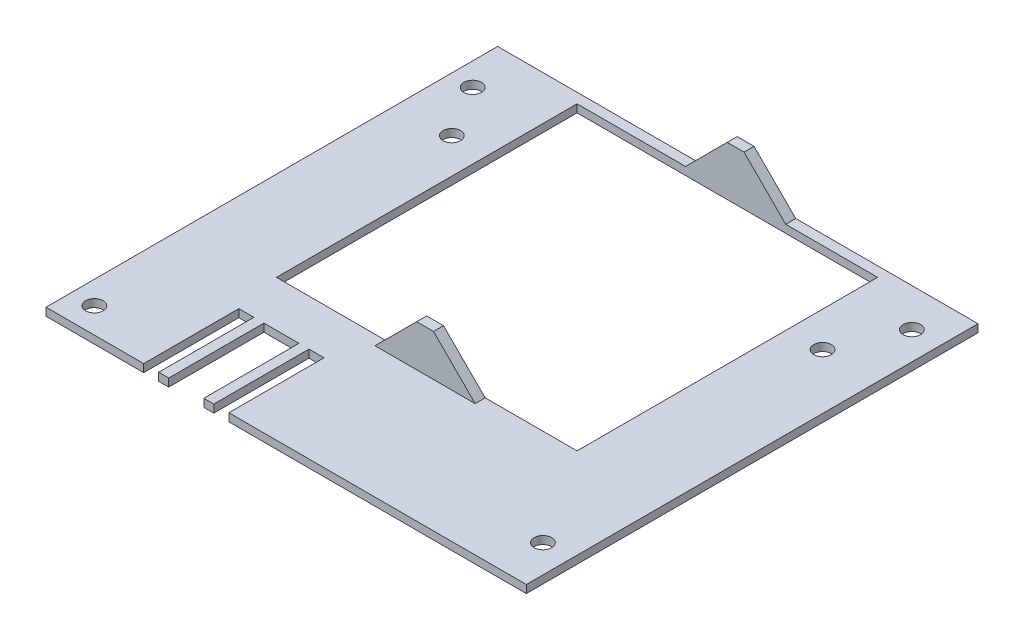
ISO-10303-21;
HEADER;
FILE_DESCRIPTION(('STEP AP214'),'2;1');
FILE_NAME('part.step','',(''),(''),'','','');
FILE_SCHEMA(('AUTOMOTIVE_DESIGN { 1 0 10303 214 1 1 1 1 }'));
ENDSEC;
DATA;
#1=APPLICATION_CONTEXT('core data for automotive mechanical design processes');
#2=APPLICATION_PROTOCOL_DEFINITION('international standard','automotive_design',2000,#1);
#3=PRODUCT_CONTEXT('',#1,'mechanical');
#4=PRODUCT('Part','Part','',(#3));
#5=PRODUCT_RELATED_PRODUCT_CATEGORY('part','',(#4));
#6=PRODUCT_DEFINITION_FORMATION('','',#4);
#7=PRODUCT_DEFINITION_CONTEXT('part definition',#1,'design');
#8=PRODUCT_DEFINITION('design','',#6,#7);
#9=PRODUCT_DEFINITION_SHAPE('','',#8);
#10=(LENGTH_UNIT() NAMED_UNIT(*) SI_UNIT(.MILLI.,.METRE.));
#11=(NAMED_UNIT(*) PLANE_ANGLE_UNIT() SI_UNIT($,.RADIAN.));
#12=(NAMED_UNIT(*) SI_UNIT($,.STERADIAN.) SOLID_ANGLE_UNIT());
#13=UNCERTAINTY_MEASURE_WITH_UNIT(LENGTH_MEASURE(1.E-05),#10,'distance_accuracy_value','');
#14=(GEOMETRIC_REPRESENTATION_CONTEXT(3) GLOBAL_UNCERTAINTY_ASSIGNED_CONTEXT((#13)) GLOBAL_UNIT_ASSIGNED_CONTEXT((#10,
#11,#12)) REPRESENTATION_CONTEXT('',''));
#15=CARTESIAN_POINT('',(0.,0.,0.));
#16=DIRECTION('',(0.,0.,1.));
#17=DIRECTION('',(1.,0.,0.));
#18=AXIS2_PLACEMENT_3D('',#15,#16,#17);
#19=CARTESIAN_POINT('',(-32.2440500490529,1.57,-18.5489965335949));
#20=DIRECTION('',(0.,0.,-1.));
#21=DIRECTION('',(-1.,0.,0.));
#22=AXIS2_PLACEMENT_3D('',#19,#20,#21);
#23=PLANE('',#22);
#24=DIRECTION('',(1.,0.,0.));
#25=VECTOR('',#24,1.);
#26=CARTESIAN_POINT('',(-32.2440500490529,0.,-18.5489965335949));
#27=LINE('',#26,#25);
#28=CARTESIAN_POINT('',(-0.244050049052909,0.,-18.5489965335949));
#29=VERTEX_POINT('',#28);
#30=CARTESIAN_POINT('',(1.75594995094709,0.,-18.5489965335949));
#31=VERTEX_POINT('',#30);
#32=EDGE_CURVE('E518',#29,#31,#27,.T.);
#33=ORIENTED_EDGE('',*,*,#32,.T.);
#34=DIRECTION('',(0.,1.,0.));
#35=VECTOR('',#34,1.);
#36=CARTESIAN_POINT('',(1.75594995094709,0.,-18.5489965335949));
#37=LINE('',#36,#35);
#38=CARTESIAN_POINT('',(1.75594995094709,1.57,-18.5489965335949));
#39=VERTEX_POINT('',#38);
#40=EDGE_CURVE('E280',#31,#39,#37,.T.);
#41=ORIENTED_EDGE('',*,*,#40,.T.);
#42=DIRECTION('',(1.,0.,0.));
#43=VECTOR('',#42,1.);
#44=CARTESIAN_POINT('',(-32.2440500490529,1.57,-18.5489965335949));
#45=LINE('',#44,#43);
#46=CARTESIAN_POINT('',(-0.244050049052909,1.57,-18.5489965335949));
#47=VERTEX_POINT('',#46);
#48=EDGE_CURVE('E534',#47,#39,#45,.T.);
#49=ORIENTED_EDGE('',*,*,#48,.F.);
#50=DIRECTION('',(0.,1.,0.));
#51=VECTOR('',#50,1.);
#52=CARTESIAN_POINT('',(-0.244050049052909,0.,-18.5489965335949));
#53=LINE('',#52,#51);
#54=EDGE_CURVE('E318',#29,#47,#53,.T.);
#55=ORIENTED_EDGE('',*,*,#54,.F.);
#56=EDGE_LOOP('',(#33,#41,#49,#55));
#57=FACE_BOUND('',#56,.T.);
#58=ADVANCED_FACE('F35',(#57),#23,.F.);
#59=CARTESIAN_POINT('',(-9.24405004905291,0.,-18.5489965335949));
#60=VERTEX_POINT('',#59);
#61=CARTESIAN_POINT('',(-7.24405004905291,0.,-18.5489965335949));
#62=VERTEX_POINT('',#61);
#63=EDGE_CURVE('E443',#60,#62,#27,.T.);
#64=ORIENTED_EDGE('',*,*,#63,.T.);
#65=DIRECTION('',(0.,1.,0.));
#66=VECTOR('',#65,1.);
#67=CARTESIAN_POINT('',(-7.24405004905291,0.,-18.5489965335949));
#68=LINE('',#67,#66);
#69=CARTESIAN_POINT('',(-7.24405004905291,1.57,-18.5489965335949));
#70=VERTEX_POINT('',#69);
#71=EDGE_CURVE('E306',#62,#70,#68,.T.);
#72=ORIENTED_EDGE('',*,*,#71,.T.);
#73=CARTESIAN_POINT('',(-9.24405004905291,1.57,-18.5489965335949));
#74=VERTEX_POINT('',#73);
#75=EDGE_CURVE('E435',#74,#70,#45,.T.);
#76=ORIENTED_EDGE('',*,*,#75,.F.);
#77=DIRECTION('',(0.,1.,0.));
#78=VECTOR('',#77,1.);
#79=CARTESIAN_POINT('',(-9.24405004905291,0.,-18.5489965335949));
#80=LINE('',#79,#78);
#81=EDGE_CURVE('E340',#60,#74,#80,.T.);
#82=ORIENTED_EDGE('',*,*,#81,.F.);
#83=EDGE_LOOP('',(#64,#72,#76,#82));
#84=FACE_BOUND('',#83,.T.);
#85=ADVANCED_FACE('F516',(#84),#23,.F.);
#86=CARTESIAN_POINT('',(4.75594995094709,0.,-18.5489965335949));
#87=VERTEX_POINT('',#86);
#88=CARTESIAN_POINT('',(64.1459499509471,0.,-18.5489965335949));
#89=VERTEX_POINT('',#88);
#90=EDGE_CURVE('E429',#87,#89,#27,.T.);
#91=ORIENTED_EDGE('',*,*,#90,.T.);
#92=DIRECTION('',(0.,1.,0.));
#93=VECTOR('',#92,1.);
#94=CARTESIAN_POINT('',(64.1459499509471,-8.43,-18.5489965335949));
#95=LINE('',#94,#93);
#96=CARTESIAN_POINT('',(64.1459499509471,1.57,-18.5489965335949));
#97=VERTEX_POINT('',#96);
#98=EDGE_CURVE('E58',#89,#97,#95,.T.);
#99=ORIENTED_EDGE('',*,*,#98,.T.);
#100=CARTESIAN_POINT('',(4.75594995094709,1.57,-18.5489965335949));
#101=VERTEX_POINT('',#100);
#102=EDGE_CURVE('E436',#101,#97,#45,.T.);
#103=ORIENTED_EDGE('',*,*,#102,.F.);
#104=DIRECTION('',(0.,1.,0.));
#105=VECTOR('',#104,1.);
#106=CARTESIAN_POINT('',(4.75594995094709,0.,-18.5489965335949));
#107=LINE('',#106,#105);
#108=EDGE_CURVE('E292',#87,#101,#107,.T.);
#109=ORIENTED_EDGE('',*,*,#108,.F.);
#110=EDGE_LOOP('',(#91,#99,#103,#109));
#111=FACE_BOUND('',#110,.T.);
#112=ADVANCED_FACE('F527',(#111),#23,.F.);
#113=CARTESIAN_POINT('',(0.,1.57,0.));
#114=DIRECTION('',(0.,1.,0.));
#115=DIRECTION('',(0.,0.,1.));
#116=AXIS2_PLACEMENT_3D('',#113,#114,#115);
#117=PLANE('',#116);
#118=DIRECTION('',(-1.,0.,0.));
#119=VECTOR('',#118,1.);
#120=CARTESIAN_POINT('',(-13.8940500490529,1.57,-106.718996533595));
#121=LINE('',#120,#119);
#122=CARTESIAN_POINT('',(7.75594995094709,1.57,-106.718996533595));
#123=VERTEX_POINT('',#122);
#124=CARTESIAN_POINT('',(-13.8940500490529,1.57,-106.718996533595));
#125=VERTEX_POINT('',#124);
#126=EDGE_CURVE('E249',#123,#125,#121,.T.);
#127=ORIENTED_EDGE('',*,*,#126,.F.);
#128=DIRECTION('',(0.,0.,-1.));
#129=VECTOR('',#128,1.);
#130=CARTESIAN_POINT('',(7.75594995094709,1.57,-106.718996533595));
#131=LINE('',#130,#129);
#132=CARTESIAN_POINT('',(7.75594995094709,1.57,-108.718996533595));
#133=VERTEX_POINT('',#132);
#134=EDGE_CURVE('E357',#123,#133,#131,.T.);
#135=ORIENTED_EDGE('',*,*,#134,.T.);
#136=DIRECTION('',(-1.,0.,0.));
#137=VECTOR('',#136,1.);
#138=CARTESIAN_POINT('',(-32.2440500490529,1.57,-108.718996533595));
#139=LINE('',#138,#137);
#140=CARTESIAN_POINT('',(-31.7440500490529,1.57,-108.718996533595));
#141=VERTEX_POINT('',#140);
#142=EDGE_CURVE('E434',#133,#141,#139,.T.);
#143=ORIENTED_EDGE('',*,*,#142,.T.);
#144=DIRECTION('',(0.,0.,-1.));
#145=VECTOR('',#144,1.);
#146=CARTESIAN_POINT('',(-31.7440500490529,1.57,-18.5489965335949));
#147=LINE('',#146,#145);
#148=CARTESIAN_POINT('',(-31.7440500490529,1.57,-18.5489965335949));
#149=VERTEX_POINT('',#148);
#150=EDGE_CURVE('E261',#149,#141,#147,.T.);
#151=ORIENTED_EDGE('',*,*,#150,.F.);
#152=CARTESIAN_POINT('',(-12.2440500490529,1.57,-18.5489965335949));
#153=VERTEX_POINT('',#152);
#154=EDGE_CURVE('E432',#149,#153,#45,.T.);
#155=ORIENTED_EDGE('',*,*,#154,.T.);
#156=DIRECTION('',(0.,0.,1.));
#157=VECTOR('',#156,1.);
#158=CARTESIAN_POINT('',(-12.2440500490529,1.57,-18.5489965335949));
#159=LINE('',#158,#157);
#160=CARTESIAN_POINT('',(-12.2440500490529,1.57,-37.5489965335949));
#161=VERTEX_POINT('',#160);
#162=EDGE_CURVE('E326',#161,#153,#159,.T.);
#163=ORIENTED_EDGE('',*,*,#162,.F.);
#164=DIRECTION('',(-1.,0.,0.));
#165=VECTOR('',#164,1.);
#166=CARTESIAN_POINT('',(-9.24405004905291,1.57,-37.5489965335949));
#167=LINE('',#166,#165);
#168=CARTESIAN_POINT('',(-9.24405004905291,1.57,-37.5489965335949));
#169=VERTEX_POINT('',#168);
#170=EDGE_CURVE('E335',#169,#161,#167,.T.);
#171=ORIENTED_EDGE('',*,*,#170,.F.);
#172=DIRECTION('',(0.,0.,-1.));
#173=VECTOR('',#172,1.);
#174=CARTESIAN_POINT('',(-9.24405004905291,1.57,-18.5489965335949));
#175=LINE('',#174,#173);
#176=EDGE_CURVE('E315',#74,#169,#175,.T.);
#177=ORIENTED_EDGE('',*,*,#176,.F.);
#178=ORIENTED_EDGE('',*,*,#75,.T.);
#179=DIRECTION('',(0.,0.,1.));
#180=VECTOR('',#179,1.);
#181=CARTESIAN_POINT('',(-7.24405004905291,1.57,-18.5489965335949));
#182=LINE('',#181,#180);
#183=CARTESIAN_POINT('',(-7.24405004905291,1.57,-37.5489965335949));
#184=VERTEX_POINT('',#183);
#185=EDGE_CURVE('E289',#184,#70,#182,.T.);
#186=ORIENTED_EDGE('',*,*,#185,.F.);
#187=DIRECTION('',(-1.,0.,0.));
#188=VECTOR('',#187,1.);
#189=CARTESIAN_POINT('',(-7.24405004905291,1.57,-37.5489965335949));
#190=LINE('',#189,#188);
#191=CARTESIAN_POINT('',(-0.244050049052909,1.57,-37.5489965335949));
#192=VERTEX_POINT('',#191);
#193=EDGE_CURVE('E300',#192,#184,#190,.T.);
#194=ORIENTED_EDGE('',*,*,#193,.F.);
#195=DIRECTION('',(0.,0.,-1.));
#196=VECTOR('',#195,1.);
#197=CARTESIAN_POINT('',(-0.244050049052909,1.57,-18.5489965335949));
#198=LINE('',#197,#196);
#199=EDGE_CURVE('E308',#47,#192,#198,.T.);
#200=ORIENTED_EDGE('',*,*,#199,.F.);
#201=ORIENTED_EDGE('',*,*,#48,.T.);
#202=DIRECTION('',(0.,0.,1.));
#203=VECTOR('',#202,1.);
#204=CARTESIAN_POINT('',(1.75594995094709,1.57,-18.5489965335949));
#205=LINE('',#204,#203);
#206=CARTESIAN_POINT('',(1.75594995094709,1.57,-37.5489965335949));
#207=VERTEX_POINT('',#206);
#208=EDGE_CURVE('E268',#207,#39,#205,.T.);
#209=ORIENTED_EDGE('',*,*,#208,.F.);
#210=DIRECTION('',(-1.,0.,0.));
#211=VECTOR('',#210,1.);
#212=CARTESIAN_POINT('',(1.75594995094709,1.57,-37.5489965335949));
#213=LINE('',#212,#211);
#214=CARTESIAN_POINT('',(4.75594995094709,1.57,-37.5489965335949));
#215=VERTEX_POINT('',#214);
#216=EDGE_CURVE('E274',#215,#207,#213,.T.);
#217=ORIENTED_EDGE('',*,*,#216,.F.);
#218=DIRECTION('',(0.,0.,-1.));
#219=VECTOR('',#218,1.);
#220=CARTESIAN_POINT('',(4.75594995094709,1.57,-18.5489965335949));
#221=LINE('',#220,#219);
#222=EDGE_CURVE('E282',#101,#215,#221,.T.);
#223=ORIENTED_EDGE('',*,*,#222,.F.);
#224=ORIENTED_EDGE('',*,*,#102,.T.);
#225=DIRECTION('',(0.,0.,1.));
#226=VECTOR('',#225,1.);
#227=CARTESIAN_POINT('',(64.1459499509471,1.57,-18.5489965335949));
#228=LINE('',#227,#226);
#229=CARTESIAN_POINT('',(64.1459499509471,1.57,-108.718996533595));
#230=VERTEX_POINT('',#229);
#231=EDGE_CURVE('E254',#230,#97,#228,.T.);
#232=ORIENTED_EDGE('',*,*,#231,.F.);
#233=CARTESIAN_POINT('',(27.7559499509471,1.57,-108.718996533595));
#234=VERTEX_POINT('',#233);
#235=EDGE_CURVE('E437',#230,#234,#139,.T.);
#236=ORIENTED_EDGE('',*,*,#235,.T.);
#237=DIRECTION('',(0.,0.,-1.));
#238=VECTOR('',#237,1.);
#239=CARTESIAN_POINT('',(27.7559499509471,1.57,-106.718996533595));
#240=LINE('',#239,#238);
#241=CARTESIAN_POINT('',(27.7559499509471,1.57,-106.718996533595));
#242=VERTEX_POINT('',#241);
#243=EDGE_CURVE('E371',#242,#234,#240,.T.);
#244=ORIENTED_EDGE('',*,*,#243,.F.);
#245=CARTESIAN_POINT('',(46.1059499509471,1.57,-106.718996533595));
#246=VERTEX_POINT('',#245);
#247=EDGE_CURVE('E229',#246,#242,#121,.T.);
#248=ORIENTED_EDGE('',*,*,#247,.F.);
#249=DIRECTION('',(0.,0.,-1.));
#250=VECTOR('',#249,1.);
#251=CARTESIAN_POINT('',(46.1059499509471,1.57,-106.718996533595));
#252=LINE('',#251,#250);
#253=CARTESIAN_POINT('',(46.1059499509471,1.57,-46.718996533595));
#254=VERTEX_POINT('',#253);
#255=EDGE_CURVE('E246',#254,#246,#252,.T.);
#256=ORIENTED_EDGE('',*,*,#255,.F.);
#257=DIRECTION('',(1.,0.,0.));
#258=VECTOR('',#257,1.);
#259=CARTESIAN_POINT('',(-13.8940500490529,1.57,-46.718996533595));
#260=LINE('',#259,#258);
#261=CARTESIAN_POINT('',(27.7559499509471,1.57,-46.718996533595));
#262=VERTEX_POINT('',#261);
#263=EDGE_CURVE('E238',#262,#254,#260,.T.);
#264=ORIENTED_EDGE('',*,*,#263,.F.);
#265=DIRECTION('',(0.,0.,-1.));
#266=VECTOR('',#265,1.);
#267=CARTESIAN_POINT('',(27.7559499509471,1.57,-44.7189965335949));
#268=LINE('',#267,#266);
#269=CARTESIAN_POINT('',(27.7559499509471,1.57,-44.7189965335949));
#270=VERTEX_POINT('',#269);
#271=EDGE_CURVE('E396',#270,#262,#268,.T.);
#272=ORIENTED_EDGE('',*,*,#271,.F.);
#273=DIRECTION('',(1.,0.,0.));
#274=VECTOR('',#273,1.);
#275=CARTESIAN_POINT('',(7.75594995094709,1.57,-44.7189965335949));
#276=LINE('',#275,#274);
#277=CARTESIAN_POINT('',(7.75594995094709,1.57,-44.7189965335949));
#278=VERTEX_POINT('',#277);
#279=EDGE_CURVE('E375',#278,#270,#276,.T.);
#280=ORIENTED_EDGE('',*,*,#279,.F.);
#281=DIRECTION('',(0.,0.,-1.));
#282=VECTOR('',#281,1.);
#283=CARTESIAN_POINT('',(7.75594995094709,1.57,-44.7189965335949));
#284=LINE('',#283,#282);
#285=CARTESIAN_POINT('',(7.75594995094709,1.57,-46.718996533595));
#286=VERTEX_POINT('',#285);
#287=EDGE_CURVE('E245',#278,#286,#284,.T.);
#288=ORIENTED_EDGE('',*,*,#287,.T.);
#289=CARTESIAN_POINT('',(-13.8940500490529,1.57,-46.718996533595));
#290=VERTEX_POINT('',#289);
#291=EDGE_CURVE('E224',#290,#286,#260,.T.);
#292=ORIENTED_EDGE('',*,*,#291,.F.);
#293=DIRECTION('',(0.,0.,1.));
#294=VECTOR('',#293,1.);
#295=CARTESIAN_POINT('',(-13.8940500490529,1.57,-106.718996533595));
#296=LINE('',#295,#294);
#297=EDGE_CURVE('E232',#125,#290,#296,.T.);
#298=ORIENTED_EDGE('',*,*,#297,.F.);
#299=EDGE_LOOP('',(#127,#135,#143,#151,#155,#163,#171,#177,#178,#186,#194,#200,#201,#209,#217,
#223,#224,#232,#236,#244,#248,#256,#264,#272,#280,#288,#292,#298));
#300=FACE_BOUND('',#299,.T.);
#301=CARTESIAN_POINT('',(58.5659499509471,1.57,-27.438996533595));
#302=DIRECTION('',(0.,1.,0.));
#303=DIRECTION('',(0.,0.,1.));
#304=AXIS2_PLACEMENT_3D('',#301,#302,#303);
#305=CIRCLE('',#304,1.75);
#306=CARTESIAN_POINT('',(58.5659499509471,1.57,-25.6889965335949));
#307=VERTEX_POINT('',#306);
#308=EDGE_CURVE('E423',#307,#307,#305,.T.);
#309=ORIENTED_EDGE('',*,*,#308,.F.);
#310=EDGE_LOOP('',(#309));
#311=FACE_BOUND('',#310,.T.);
#312=CARTESIAN_POINT('',(-27.1640500490529,1.57,-23.6289965335949));
#313=DIRECTION('',(0.,1.,0.));
#314=DIRECTION('',(0.,0.,1.));
#315=AXIS2_PLACEMENT_3D('',#312,#313,#314);
#316=CIRCLE('',#315,1.75);
#317=CARTESIAN_POINT('',(-27.1640500490529,1.57,-21.8789965335949));
#318=VERTEX_POINT('',#317);
#319=EDGE_CURVE('E417',#318,#318,#316,.T.);
#320=ORIENTED_EDGE('',*,*,#319,.F.);
#321=EDGE_LOOP('',(#320));
#322=FACE_BOUND('',#321,.T.);
#323=CARTESIAN_POINT('',(-27.1640500490529,1.57,-99.1389965335949));
#324=DIRECTION('',(0.,1.,0.));
#325=DIRECTION('',(0.,0.,1.));
#326=AXIS2_PLACEMENT_3D('',#323,#324,#325);
#327=CIRCLE('',#326,1.75);
#328=CARTESIAN_POINT('',(-27.1640500490529,1.57,-97.3889965335949));
#329=VERTEX_POINT('',#328);
#330=EDGE_CURVE('E410',#329,#329,#327,.T.);
#331=ORIENTED_EDGE('',*,*,#330,.F.);
#332=EDGE_LOOP('',(#331));
#333=FACE_BOUND('',#332,.T.);
#334=CARTESIAN_POINT('',(58.5659499509471,1.57,-101.098996533595));
#335=DIRECTION('',(0.,1.,0.));
#336=DIRECTION('',(0.,0.,1.));
#337=AXIS2_PLACEMENT_3D('',#334,#335,#336);
#338=CIRCLE('',#337,1.75);
#339=CARTESIAN_POINT('',(58.5659499509471,1.57,-99.3489965335949));
#340=VERTEX_POINT('',#339);
#341=EDGE_CURVE('E411',#340,#340,#338,.T.);
#342=ORIENTED_EDGE('',*,*,#341,.F.);
#343=EDGE_LOOP('',(#342));
#344=FACE_BOUND('',#343,.T.);
#345=CARTESIAN_POINT('',(-20.8940500490529,1.57,-88.7189965335949));
#346=DIRECTION('',(0.,1.,0.));
#347=DIRECTION('',(0.,0.,1.));
#348=AXIS2_PLACEMENT_3D('',#345,#346,#347);
#349=CIRCLE('',#348,1.75);
#350=CARTESIAN_POINT('',(-20.8940500490529,1.57,-86.9689965335949));
#351=VERTEX_POINT('',#350);
#352=EDGE_CURVE('E403',#351,#351,#349,.T.);
#353=ORIENTED_EDGE('',*,*,#352,.F.);
#354=EDGE_LOOP('',(#353));
#355=FACE_BOUND('',#354,.T.);
#356=CARTESIAN_POINT('',(53.1059499509471,1.57,-88.7189965335949));
#357=DIRECTION('',(0.,1.,0.));
#358=DIRECTION('',(0.,0.,1.));
#359=AXIS2_PLACEMENT_3D('',#356,#357,#358);
#360=CIRCLE('',#359,1.75);
#361=CARTESIAN_POINT('',(53.1059499509471,1.57,-86.9689965335949));
#362=VERTEX_POINT('',#361);
#363=EDGE_CURVE('E399',#362,#362,#360,.T.);
#364=ORIENTED_EDGE('',*,*,#363,.F.);
#365=EDGE_LOOP('',(#364));
#366=FACE_BOUND('',#365,.T.);
#367=ADVANCED_FACE('F241',(#300,#311,#322,#333,#344,#355,#366),#117,.T.);
#368=ORIENTED_EDGE('',*,*,#154,.F.);
#369=DIRECTION('',(0.,1.,0.));
#370=VECTOR('',#369,1.);
#371=CARTESIAN_POINT('',(-31.7440500490529,-8.43,-18.5489965335949));
#372=LINE('',#371,#370);
#373=CARTESIAN_POINT('',(-31.7440500490529,0.,-18.5489965335949));
#374=VERTEX_POINT('',#373);
#375=EDGE_CURVE('E264',#374,#149,#372,.T.);
#376=ORIENTED_EDGE('',*,*,#375,.F.);
#377=CARTESIAN_POINT('',(-12.2440500490529,0.,-18.5489965335949));
#378=VERTEX_POINT('',#377);
#379=EDGE_CURVE('E440',#374,#378,#27,.T.);
#380=ORIENTED_EDGE('',*,*,#379,.T.);
#381=DIRECTION('',(0.,1.,0.));
#382=VECTOR('',#381,1.);
#383=CARTESIAN_POINT('',(-12.2440500490529,0.,-18.5489965335949));
#384=LINE('',#383,#382);
#385=EDGE_CURVE('E343',#378,#153,#384,.T.);
#386=ORIENTED_EDGE('',*,*,#385,.T.);
#387=EDGE_LOOP('',(#368,#376,#380,#386));
#388=FACE_BOUND('',#387,.T.);
#389=ADVANCED_FACE('F37',(#388),#23,.F.);
#390=CARTESIAN_POINT('',(-32.2440500490529,1.57,-108.718996533595));
#391=DIRECTION('',(0.,0.,1.));
#392=DIRECTION('',(1.,0.,0.));
#393=AXIS2_PLACEMENT_3D('',#390,#391,#392);
#394=PLANE('',#393);
#395=ORIENTED_EDGE('',*,*,#235,.F.);
#396=DIRECTION('',(0.,1.,0.));
#397=VECTOR('',#396,1.);
#398=CARTESIAN_POINT('',(64.1459499509471,-8.43,-108.718996533595));
#399=LINE('',#398,#397);
#400=CARTESIAN_POINT('',(64.1459499509471,0.,-108.718996533595));
#401=VERTEX_POINT('',#400);
#402=EDGE_CURVE('E259',#401,#230,#399,.T.);
#403=ORIENTED_EDGE('',*,*,#402,.F.);
#404=DIRECTION('',(-1.,0.,0.));
#405=VECTOR('',#404,1.);
#406=CARTESIAN_POINT('',(-32.2440500490529,0.,-108.718996533595));
#407=LINE('',#406,#405);
#408=CARTESIAN_POINT('',(-31.7440500490529,0.,-108.718996533595));
#409=VERTEX_POINT('',#408);
#410=EDGE_CURVE('E442',#401,#409,#407,.T.);
#411=ORIENTED_EDGE('',*,*,#410,.T.);
#412=DIRECTION('',(0.,1.,0.));
#413=VECTOR('',#412,1.);
#414=CARTESIAN_POINT('',(-31.7440500490529,-8.43,-108.718996533595));
#415=LINE('',#414,#413);
#416=EDGE_CURVE('E265',#409,#141,#415,.T.);
#417=ORIENTED_EDGE('',*,*,#416,.T.);
#418=ORIENTED_EDGE('',*,*,#142,.F.);
#419=DIRECTION('',(-0.707106781186606,-0.707106781186489,0.));
#420=VECTOR('',#419,1.);
#421=CARTESIAN_POINT('',(16.0734878161638,9.88753786521537,-108.718996533595));
#422=LINE('',#421,#420);
#423=CARTESIAN_POINT('',(16.0734878161638,9.88753786521537,-108.718996533595));
#424=VERTEX_POINT('',#423);
#425=EDGE_CURVE('E352',#424,#133,#422,.T.);
#426=ORIENTED_EDGE('',*,*,#425,.F.);
#427=DIRECTION('',(-1.,0.,0.));
#428=VECTOR('',#427,1.);
#429=CARTESIAN_POINT('',(19.4384120857313,9.88753786521537,-108.718996533595));
#430=LINE('',#429,#428);
#431=CARTESIAN_POINT('',(19.4384120857313,9.88753786521537,-108.718996533595));
#432=VERTEX_POINT('',#431);
#433=EDGE_CURVE('E359',#432,#424,#430,.T.);
#434=ORIENTED_EDGE('',*,*,#433,.F.);
#435=DIRECTION('',(-0.707106781186565,0.70710678118653,0.));
#436=VECTOR('',#435,1.);
#437=CARTESIAN_POINT('',(27.7559499509471,1.57,-108.718996533595));
#438=LINE('',#437,#436);
#439=EDGE_CURVE('E342',#234,#432,#438,.T.);
#440=ORIENTED_EDGE('',*,*,#439,.F.);
#441=EDGE_LOOP('',(#395,#403,#411,#417,#418,#426,#434,#440));
#442=FACE_BOUND('',#441,.T.);
#443=ADVANCED_FACE('F487',(#442),#394,.F.);
#444=CARTESIAN_POINT('',(0.,0.,0.));
#445=DIRECTION('',(0.,1.,0.));
#446=DIRECTION('',(0.,0.,1.));
#447=AXIS2_PLACEMENT_3D('',#444,#445,#446);
#448=PLANE('',#447);
#449=DIRECTION('',(-1.,0.,0.));
#450=VECTOR('',#449,1.);
#451=CARTESIAN_POINT('',(0.,0.,-106.718996533595));
#452=LINE('',#451,#450);
#453=CARTESIAN_POINT('',(46.1059499509471,0.,-106.718996533595));
#454=VERTEX_POINT('',#453);
#455=CARTESIAN_POINT('',(-13.8940500490529,0.,-106.718996533595));
#456=VERTEX_POINT('',#455);
#457=EDGE_CURVE('E43',#454,#456,#452,.T.);
#458=ORIENTED_EDGE('',*,*,#457,.T.);
#459=DIRECTION('',(0.,0.,1.));
#460=VECTOR('',#459,1.);
#461=CARTESIAN_POINT('',(-13.8940500490529,0.,0.));
#462=LINE('',#461,#460);
#463=CARTESIAN_POINT('',(-13.8940500490529,0.,-46.718996533595));
#464=VERTEX_POINT('',#463);
#465=EDGE_CURVE('E11',#456,#464,#462,.T.);
#466=ORIENTED_EDGE('',*,*,#465,.T.);
#467=DIRECTION('',(1.,0.,0.));
#468=VECTOR('',#467,1.);
#469=CARTESIAN_POINT('',(0.,0.,-46.718996533595));
#470=LINE('',#469,#468);
#471=CARTESIAN_POINT('',(46.1059499509471,0.,-46.718996533595));
#472=VERTEX_POINT('',#471);
#473=EDGE_CURVE('E227',#464,#472,#470,.T.);
#474=ORIENTED_EDGE('',*,*,#473,.T.);
#475=DIRECTION('',(0.,0.,-1.));
#476=VECTOR('',#475,1.);
#477=CARTESIAN_POINT('',(46.1059499509471,0.,0.));
#478=LINE('',#477,#476);
#479=EDGE_CURVE('E454',#472,#454,#478,.T.);
#480=ORIENTED_EDGE('',*,*,#479,.T.);
#481=EDGE_LOOP('',(#458,#466,#474,#480));
#482=FACE_BOUND('',#481,.T.);
#483=ORIENTED_EDGE('',*,*,#410,.F.);
#484=DIRECTION('',(0.,0.,1.));
#485=VECTOR('',#484,1.);
#486=CARTESIAN_POINT('',(64.1459499509471,0.,0.));
#487=LINE('',#486,#485);
#488=EDGE_CURVE('E451',#401,#89,#487,.T.);
#489=ORIENTED_EDGE('',*,*,#488,.T.);
#490=ORIENTED_EDGE('',*,*,#90,.F.);
#491=DIRECTION('',(0.,0.,-1.));
#492=VECTOR('',#491,1.);
#493=CARTESIAN_POINT('',(4.75594995094709,0.,-18.5489965335949));
#494=LINE('',#493,#492);
#495=CARTESIAN_POINT('',(4.75594995094709,0.,-37.5489965335949));
#496=VERTEX_POINT('',#495);
#497=EDGE_CURVE('E273',#87,#496,#494,.T.);
#498=ORIENTED_EDGE('',*,*,#497,.T.);
#499=DIRECTION('',(-1.,0.,0.));
#500=VECTOR('',#499,1.);
#501=CARTESIAN_POINT('',(1.75594995094709,0.,-37.5489965335949));
#502=LINE('',#501,#500);
#503=CARTESIAN_POINT('',(1.75594995094709,0.,-37.5489965335949));
#504=VERTEX_POINT('',#503);
#505=EDGE_CURVE('E277',#496,#504,#502,.T.);
#506=ORIENTED_EDGE('',*,*,#505,.T.);
#507=DIRECTION('',(0.,0.,1.));
#508=VECTOR('',#507,1.);
#509=CARTESIAN_POINT('',(1.75594995094709,0.,-18.5489965335949));
#510=LINE('',#509,#508);
#511=EDGE_CURVE('E270',#504,#31,#510,.T.);
#512=ORIENTED_EDGE('',*,*,#511,.T.);
#513=ORIENTED_EDGE('',*,*,#32,.F.);
#514=DIRECTION('',(0.,0.,-1.));
#515=VECTOR('',#514,1.);
#516=CARTESIAN_POINT('',(-0.244050049052909,0.,-18.5489965335949));
#517=LINE('',#516,#515);
#518=CARTESIAN_POINT('',(-0.244050049052909,0.,-37.5489965335949));
#519=VERTEX_POINT('',#518);
#520=EDGE_CURVE('E299',#29,#519,#517,.T.);
#521=ORIENTED_EDGE('',*,*,#520,.T.);
#522=DIRECTION('',(-1.,0.,0.));
#523=VECTOR('',#522,1.);
#524=CARTESIAN_POINT('',(-7.24405004905291,0.,-37.5489965335949));
#525=LINE('',#524,#523);
#526=CARTESIAN_POINT('',(-7.24405004905291,0.,-37.5489965335949));
#527=VERTEX_POINT('',#526);
#528=EDGE_CURVE('E303',#519,#527,#525,.T.);
#529=ORIENTED_EDGE('',*,*,#528,.T.);
#530=DIRECTION('',(0.,0.,1.));
#531=VECTOR('',#530,1.);
#532=CARTESIAN_POINT('',(-7.24405004905291,0.,-18.5489965335949));
#533=LINE('',#532,#531);
#534=EDGE_CURVE('E296',#527,#62,#533,.T.);
#535=ORIENTED_EDGE('',*,*,#534,.T.);
#536=ORIENTED_EDGE('',*,*,#63,.F.);
#537=DIRECTION('',(0.,0.,-1.));
#538=VECTOR('',#537,1.);
#539=CARTESIAN_POINT('',(-9.24405004905291,0.,-18.5489965335949));
#540=LINE('',#539,#538);
#541=CARTESIAN_POINT('',(-9.24405004905291,0.,-37.5489965335949));
#542=VERTEX_POINT('',#541);
#543=EDGE_CURVE('E322',#60,#542,#540,.T.);
#544=ORIENTED_EDGE('',*,*,#543,.T.);
#545=DIRECTION('',(-1.,0.,0.));
#546=VECTOR('',#545,1.);
#547=CARTESIAN_POINT('',(-9.24405004905291,0.,-37.5489965335949));
#548=LINE('',#547,#546);
#549=CARTESIAN_POINT('',(-12.2440500490529,0.,-37.5489965335949));
#550=VERTEX_POINT('',#549);
#551=EDGE_CURVE('E325',#542,#550,#548,.T.);
#552=ORIENTED_EDGE('',*,*,#551,.T.);
#553=DIRECTION('',(0.,0.,1.));
#554=VECTOR('',#553,1.);
#555=CARTESIAN_POINT('',(-12.2440500490529,0.,-18.5489965335949));
#556=LINE('',#555,#554);
#557=EDGE_CURVE('E329',#550,#378,#556,.T.);
#558=ORIENTED_EDGE('',*,*,#557,.T.);
#559=ORIENTED_EDGE('',*,*,#379,.F.);
#560=DIRECTION('',(0.,0.,-1.));
#561=VECTOR('',#560,1.);
#562=CARTESIAN_POINT('',(-31.7440500490529,0.,0.));
#563=LINE('',#562,#561);
#564=EDGE_CURVE('E439',#374,#409,#563,.T.);
#565=ORIENTED_EDGE('',*,*,#564,.T.);
#566=EDGE_LOOP('',(#483,#489,#490,#498,#506,#512,#513,#521,#529,#535,#536,#544,#552,#558,#559,#565));
#567=FACE_BOUND('',#566,.T.);
#568=CARTESIAN_POINT('',(53.1059499509471,0.,-88.7189965335949));
#569=DIRECTION('',(0.,1.,0.));
#570=DIRECTION('',(0.,0.,1.));
#571=AXIS2_PLACEMENT_3D('',#568,#569,#570);
#572=CIRCLE('',#571,1.75);
#573=CARTESIAN_POINT('',(53.1059499509471,0.,-86.9689965335949));
#574=VERTEX_POINT('',#573);
#575=EDGE_CURVE('E402',#574,#574,#572,.T.);
#576=ORIENTED_EDGE('',*,*,#575,.T.);
#577=EDGE_LOOP('',(#576));
#578=FACE_BOUND('',#577,.T.);
#579=CARTESIAN_POINT('',(-20.8940500490529,0.,-88.7189965335949));
#580=DIRECTION('',(0.,1.,0.));
#581=DIRECTION('',(0.,0.,1.));
#582=AXIS2_PLACEMENT_3D('',#579,#580,#581);
#583=CIRCLE('',#582,1.75);
#584=CARTESIAN_POINT('',(-20.8940500490529,0.,-86.9689965335949));
#585=VERTEX_POINT('',#584);
#586=EDGE_CURVE('E406',#585,#585,#583,.T.);
#587=ORIENTED_EDGE('',*,*,#586,.T.);
#588=EDGE_LOOP('',(#587));
#589=FACE_BOUND('',#588,.T.);
#590=CARTESIAN_POINT('',(58.5659499509471,0.,-101.098996533595));
#591=DIRECTION('',(0.,1.,0.));
#592=DIRECTION('',(0.,0.,1.));
#593=AXIS2_PLACEMENT_3D('',#590,#591,#592);
#594=CIRCLE('',#593,1.75);
#595=CARTESIAN_POINT('',(58.5659499509471,0.,-99.3489965335949));
#596=VERTEX_POINT('',#595);
#597=EDGE_CURVE('E407',#596,#596,#594,.T.);
#598=ORIENTED_EDGE('',*,*,#597,.T.);
#599=EDGE_LOOP('',(#598));
#600=FACE_BOUND('',#599,.T.);
#601=CARTESIAN_POINT('',(-27.1640500490529,0.,-99.1389965335949));
#602=DIRECTION('',(0.,1.,0.));
#603=DIRECTION('',(0.,0.,1.));
#604=AXIS2_PLACEMENT_3D('',#601,#602,#603);
#605=CIRCLE('',#604,1.75);
#606=CARTESIAN_POINT('',(-27.1640500490529,0.,-97.3889965335949));
#607=VERTEX_POINT('',#606);
#608=EDGE_CURVE('E414',#607,#607,#605,.T.);
#609=ORIENTED_EDGE('',*,*,#608,.T.);
#610=EDGE_LOOP('',(#609));
#611=FACE_BOUND('',#610,.T.);
#612=CARTESIAN_POINT('',(-27.1640500490529,0.,-23.6289965335949));
#613=DIRECTION('',(0.,1.,0.));
#614=DIRECTION('',(0.,0.,1.));
#615=AXIS2_PLACEMENT_3D('',#612,#613,#614);
#616=CIRCLE('',#615,1.75);
#617=CARTESIAN_POINT('',(-27.1640500490529,0.,-21.8789965335949));
#618=VERTEX_POINT('',#617);
#619=EDGE_CURVE('E420',#618,#618,#616,.T.);
#620=ORIENTED_EDGE('',*,*,#619,.T.);
#621=EDGE_LOOP('',(#620));
#622=FACE_BOUND('',#621,.T.);
#623=CARTESIAN_POINT('',(58.5659499509471,0.,-27.438996533595));
#624=DIRECTION('',(0.,1.,0.));
#625=DIRECTION('',(0.,0.,1.));
#626=AXIS2_PLACEMENT_3D('',#623,#624,#625);
#627=CIRCLE('',#626,1.75);
#628=CARTESIAN_POINT('',(58.5659499509471,0.,-25.6889965335949));
#629=VERTEX_POINT('',#628);
#630=EDGE_CURVE('E426',#629,#629,#627,.T.);
#631=ORIENTED_EDGE('',*,*,#630,.T.);
#632=EDGE_LOOP('',(#631));
#633=FACE_BOUND('',#632,.T.);
#634=ADVANCED_FACE('F458',(#482,#567,#578,#589,#600,#611,#622,#633),#448,.F.);
#635=CARTESIAN_POINT('',(58.5659499509471,0.,-27.438996533595));
#636=DIRECTION('',(0.,1.,0.));
#637=DIRECTION('',(0.,0.,1.));
#638=AXIS2_PLACEMENT_3D('',#635,#636,#637);
#639=CYLINDRICAL_SURFACE('',#638,1.75);
#640=ORIENTED_EDGE('',*,*,#630,.F.);
#641=EDGE_LOOP('',(#640));
#642=FACE_BOUND('',#641,.T.);
#643=ORIENTED_EDGE('',*,*,#308,.T.);
#644=EDGE_LOOP('',(#643));
#645=FACE_BOUND('',#644,.T.);
#646=ADVANCED_FACE('F600',(#642,#645),#639,.F.);
#647=CARTESIAN_POINT('',(-27.1640500490529,0.,-23.6289965335949));
#648=DIRECTION('',(0.,1.,0.));
#649=DIRECTION('',(0.,0.,1.));
#650=AXIS2_PLACEMENT_3D('',#647,#648,#649);
#651=CYLINDRICAL_SURFACE('',#650,1.75);
#652=ORIENTED_EDGE('',*,*,#619,.F.);
#653=EDGE_LOOP('',(#652));
#654=FACE_BOUND('',#653,.T.);
#655=ORIENTED_EDGE('',*,*,#319,.T.);
#656=EDGE_LOOP('',(#655));
#657=FACE_BOUND('',#656,.T.);
#658=ADVANCED_FACE('F829',(#654,#657),#651,.F.);
#659=CARTESIAN_POINT('',(-27.1640500490529,0.,-99.1389965335949));
#660=DIRECTION('',(0.,1.,0.));
#661=DIRECTION('',(0.,0.,1.));
#662=AXIS2_PLACEMENT_3D('',#659,#660,#661);
#663=CYLINDRICAL_SURFACE('',#662,1.75);
#664=ORIENTED_EDGE('',*,*,#608,.F.);
#665=EDGE_LOOP('',(#664));
#666=FACE_BOUND('',#665,.T.);
#667=ORIENTED_EDGE('',*,*,#330,.T.);
#668=EDGE_LOOP('',(#667));
#669=FACE_BOUND('',#668,.T.);
#670=ADVANCED_FACE('F819',(#666,#669),#663,.F.);
#671=CARTESIAN_POINT('',(58.5659499509471,0.,-101.098996533595));
#672=DIRECTION('',(0.,1.,0.));
#673=DIRECTION('',(0.,0.,1.));
#674=AXIS2_PLACEMENT_3D('',#671,#672,#673);
#675=CYLINDRICAL_SURFACE('',#674,1.75);
#676=ORIENTED_EDGE('',*,*,#597,.F.);
#677=EDGE_LOOP('',(#676));
#678=FACE_BOUND('',#677,.T.);
#679=ORIENTED_EDGE('',*,*,#341,.T.);
#680=EDGE_LOOP('',(#679));
#681=FACE_BOUND('',#680,.T.);
#682=ADVANCED_FACE('F809',(#678,#681),#675,.F.);
#683=CARTESIAN_POINT('',(-20.8940500490529,-21.43,-88.7189965335949));
#684=DIRECTION('',(0.,1.,0.));
#685=DIRECTION('',(0.,0.,1.));
#686=AXIS2_PLACEMENT_3D('',#683,#684,#685);
#687=CYLINDRICAL_SURFACE('',#686,1.75);
#688=ORIENTED_EDGE('',*,*,#352,.T.);
#689=EDGE_LOOP('',(#688));
#690=FACE_BOUND('',#689,.T.);
#691=ORIENTED_EDGE('',*,*,#586,.F.);
#692=EDGE_LOOP('',(#691));
#693=FACE_BOUND('',#692,.T.);
#694=ADVANCED_FACE('F799',(#690,#693),#687,.F.);
#695=CARTESIAN_POINT('',(53.1059499509471,-21.43,-88.7189965335949));
#696=DIRECTION('',(0.,1.,0.));
#697=DIRECTION('',(0.,0.,1.));
#698=AXIS2_PLACEMENT_3D('',#695,#696,#697);
#699=CYLINDRICAL_SURFACE('',#698,1.75);
#700=ORIENTED_EDGE('',*,*,#363,.T.);
#701=EDGE_LOOP('',(#700));
#702=FACE_BOUND('',#701,.T.);
#703=ORIENTED_EDGE('',*,*,#575,.F.);
#704=EDGE_LOOP('',(#703));
#705=FACE_BOUND('',#704,.T.);
#706=ADVANCED_FACE('F614',(#702,#705),#699,.F.);
#707=CARTESIAN_POINT('',(27.7559499509471,1.57,-44.7189965335949));
#708=DIRECTION('',(-0.70710678118653,-0.707106781186565,0.));
#709=DIRECTION('',(0.707106781186565,-0.70710678118653,0.));
#710=AXIS2_PLACEMENT_3D('',#707,#708,#709);
#711=PLANE('',#710);
#712=DIRECTION('',(-0.707106781186565,0.70710678118653,0.));
#713=VECTOR('',#712,1.);
#714=CARTESIAN_POINT('',(27.7559499509471,1.57,-46.7189965335949));
#715=LINE('',#714,#713);
#716=CARTESIAN_POINT('',(19.4384120857313,9.88753786521537,-46.7189965335949));
#717=VERTEX_POINT('',#716);
#718=EDGE_CURVE('E374',#262,#717,#715,.T.);
#719=ORIENTED_EDGE('',*,*,#718,.T.);
#720=DIRECTION('',(0.,0.,-1.));
#721=VECTOR('',#720,1.);
#722=CARTESIAN_POINT('',(19.4384120857313,9.88753786521537,-44.7189965335949));
#723=LINE('',#722,#721);
#724=CARTESIAN_POINT('',(19.4384120857313,9.88753786521537,-44.7189965335949));
#725=VERTEX_POINT('',#724);
#726=EDGE_CURVE('E393',#725,#717,#723,.T.);
#727=ORIENTED_EDGE('',*,*,#726,.F.);
#728=DIRECTION('',(-0.707106781186565,0.70710678118653,0.));
#729=VECTOR('',#728,1.);
#730=CARTESIAN_POINT('',(27.7559499509471,1.57,-44.7189965335949));
#731=LINE('',#730,#729);
#732=EDGE_CURVE('E378',#270,#725,#731,.T.);
#733=ORIENTED_EDGE('',*,*,#732,.F.);
#734=ORIENTED_EDGE('',*,*,#271,.T.);
#735=EDGE_LOOP('',(#719,#727,#733,#734));
#736=FACE_BOUND('',#735,.T.);
#737=ADVANCED_FACE('F608',(#736),#711,.F.);
#738=CARTESIAN_POINT('',(19.4384120857313,9.88753786521537,-44.7189965335949));
#739=DIRECTION('',(0.,-1.,0.));
#740=DIRECTION('',(1.,0.,0.));
#741=AXIS2_PLACEMENT_3D('',#738,#739,#740);
#742=PLANE('',#741);
#743=DIRECTION('',(-1.,0.,0.));
#744=VECTOR('',#743,1.);
#745=CARTESIAN_POINT('',(19.4384120857313,9.88753786521537,-46.7189965335949));
#746=LINE('',#745,#744);
#747=CARTESIAN_POINT('',(16.0734878161638,9.88753786521537,-46.7189965335949));
#748=VERTEX_POINT('',#747);
#749=EDGE_CURVE('E386',#717,#748,#746,.T.);
#750=ORIENTED_EDGE('',*,*,#749,.T.);
#751=DIRECTION('',(0.,0.,-1.));
#752=VECTOR('',#751,1.);
#753=CARTESIAN_POINT('',(16.0734878161638,9.88753786521537,-44.7189965335949));
#754=LINE('',#753,#752);
#755=CARTESIAN_POINT('',(16.0734878161638,9.88753786521537,-44.7189965335949));
#756=VERTEX_POINT('',#755);
#757=EDGE_CURVE('E390',#756,#748,#754,.T.);
#758=ORIENTED_EDGE('',*,*,#757,.F.);
#759=DIRECTION('',(-1.,0.,0.));
#760=VECTOR('',#759,1.);
#761=CARTESIAN_POINT('',(19.4384120857313,9.88753786521537,-44.7189965335949));
#762=LINE('',#761,#760);
#763=EDGE_CURVE('E381',#725,#756,#762,.T.);
#764=ORIENTED_EDGE('',*,*,#763,.F.);
#765=ORIENTED_EDGE('',*,*,#726,.T.);
#766=EDGE_LOOP('',(#750,#758,#764,#765));
#767=FACE_BOUND('',#766,.T.);
#768=ADVANCED_FACE('F613',(#767),#742,.F.);
#769=CARTESIAN_POINT('',(16.0734878161638,9.88753786521537,-44.7189965335949));
#770=DIRECTION('',(0.707106781186489,-0.707106781186606,0.));
#771=DIRECTION('',(0.707106781186606,0.707106781186489,0.));
#772=AXIS2_PLACEMENT_3D('',#769,#770,#771);
#773=PLANE('',#772);
#774=DIRECTION('',(-0.707106781186606,-0.707106781186489,0.));
#775=VECTOR('',#774,1.);
#776=CARTESIAN_POINT('',(16.0734878161638,9.88753786521537,-46.7189965335949));
#777=LINE('',#776,#775);
#778=EDGE_CURVE('E379',#748,#286,#777,.T.);
#779=ORIENTED_EDGE('',*,*,#778,.T.);
#780=ORIENTED_EDGE('',*,*,#287,.F.);
#781=DIRECTION('',(-0.707106781186606,-0.707106781186489,0.));
#782=VECTOR('',#781,1.);
#783=CARTESIAN_POINT('',(16.0734878161638,9.88753786521537,-44.7189965335949));
#784=LINE('',#783,#782);
#785=EDGE_CURVE('E383',#756,#278,#784,.T.);
#786=ORIENTED_EDGE('',*,*,#785,.F.);
#787=ORIENTED_EDGE('',*,*,#757,.T.);
#788=EDGE_LOOP('',(#779,#780,#786,#787));
#789=FACE_BOUND('',#788,.T.);
#790=ADVANCED_FACE('F624',(#789),#773,.F.);
#791=CARTESIAN_POINT('',(0.,0.,-44.7189965335949));
#792=DIRECTION('',(0.,0.,1.));
#793=DIRECTION('',(1.,0.,0.));
#794=AXIS2_PLACEMENT_3D('',#791,#792,#793);
#795=PLANE('',#794);
#796=ORIENTED_EDGE('',*,*,#279,.T.);
#797=ORIENTED_EDGE('',*,*,#732,.T.);
#798=ORIENTED_EDGE('',*,*,#763,.T.);
#799=ORIENTED_EDGE('',*,*,#785,.T.);
#800=EDGE_LOOP('',(#796,#797,#798,#799));
#801=FACE_BOUND('',#800,.T.);
#802=ADVANCED_FACE('F629',(#801),#795,.T.);
#803=CARTESIAN_POINT('',(0.,0.,-46.7189965335949));
#804=DIRECTION('',(0.,0.,1.));
#805=DIRECTION('',(1.,0.,0.));
#806=AXIS2_PLACEMENT_3D('',#803,#804,#805);
#807=PLANE('',#806);
#808=ORIENTED_EDGE('',*,*,#718,.F.);
#809=ORIENTED_EDGE('',*,*,#263,.T.);
#810=DIRECTION('',(0.,1.,0.));
#811=VECTOR('',#810,1.);
#812=CARTESIAN_POINT('',(46.1059499509471,-8.43,-46.718996533595));
#813=LINE('',#812,#811);
#814=EDGE_CURVE('E50',#472,#254,#813,.T.);
#815=ORIENTED_EDGE('',*,*,#814,.F.);
#816=ORIENTED_EDGE('',*,*,#473,.F.);
#817=DIRECTION('',(0.,1.,0.));
#818=VECTOR('',#817,1.);
#819=CARTESIAN_POINT('',(-13.8940500490529,-8.43,-46.718996533595));
#820=LINE('',#819,#818);
#821=EDGE_CURVE('E218',#464,#290,#820,.T.);
#822=ORIENTED_EDGE('',*,*,#821,.T.);
#823=ORIENTED_EDGE('',*,*,#291,.T.);
#824=ORIENTED_EDGE('',*,*,#778,.F.);
#825=ORIENTED_EDGE('',*,*,#749,.F.);
#826=EDGE_LOOP('',(#808,#809,#815,#816,#822,#823,#824,#825));
#827=FACE_BOUND('',#826,.T.);
#828=ADVANCED_FACE('F221',(#827),#807,.F.);
#829=CARTESIAN_POINT('',(27.7559499509471,1.57,-106.718996533595));
#830=DIRECTION('',(-0.70710678118653,-0.707106781186565,0.));
#831=DIRECTION('',(0.707106781186565,-0.70710678118653,0.));
#832=AXIS2_PLACEMENT_3D('',#829,#830,#831);
#833=PLANE('',#832);
#834=ORIENTED_EDGE('',*,*,#439,.T.);
#835=DIRECTION('',(0.,0.,-1.));
#836=VECTOR('',#835,1.);
#837=CARTESIAN_POINT('',(19.4384120857313,9.88753786521537,-106.718996533595));
#838=LINE('',#837,#836);
#839=CARTESIAN_POINT('',(19.4384120857313,9.88753786521537,-106.718996533595));
#840=VERTEX_POINT('',#839);
#841=EDGE_CURVE('E368',#840,#432,#838,.T.);
#842=ORIENTED_EDGE('',*,*,#841,.F.);
#843=DIRECTION('',(-0.707106781186565,0.70710678118653,0.));
#844=VECTOR('',#843,1.);
#845=CARTESIAN_POINT('',(27.7559499509471,1.57,-106.718996533595));
#846=LINE('',#845,#844);
#847=EDGE_CURVE('E349',#242,#840,#846,.T.);
#848=ORIENTED_EDGE('',*,*,#847,.F.);
#849=ORIENTED_EDGE('',*,*,#243,.T.);
#850=EDGE_LOOP('',(#834,#842,#848,#849));
#851=FACE_BOUND('',#850,.T.);
#852=ADVANCED_FACE('F473',(#851),#833,.F.);
#853=CARTESIAN_POINT('',(19.4384120857313,9.88753786521537,-106.718996533595));
#854=DIRECTION('',(0.,-1.,0.));
#855=DIRECTION('',(1.,0.,0.));
#856=AXIS2_PLACEMENT_3D('',#853,#854,#855);
#857=PLANE('',#856);
#858=ORIENTED_EDGE('',*,*,#433,.T.);
#859=DIRECTION('',(0.,0.,-1.));
#860=VECTOR('',#859,1.);
#861=CARTESIAN_POINT('',(16.0734878161638,9.88753786521537,-106.718996533595));
#862=LINE('',#861,#860);
#863=CARTESIAN_POINT('',(16.0734878161638,9.88753786521537,-106.718996533595));
#864=VERTEX_POINT('',#863);
#865=EDGE_CURVE('E365',#864,#424,#862,.T.);
#866=ORIENTED_EDGE('',*,*,#865,.F.);
#867=DIRECTION('',(-1.,0.,0.));
#868=VECTOR('',#867,1.);
#869=CARTESIAN_POINT('',(19.4384120857313,9.88753786521537,-106.718996533595));
#870=LINE('',#869,#868);
#871=EDGE_CURVE('E351',#840,#864,#870,.T.);
#872=ORIENTED_EDGE('',*,*,#871,.F.);
#873=ORIENTED_EDGE('',*,*,#841,.T.);
#874=EDGE_LOOP('',(#858,#866,#872,#873));
#875=FACE_BOUND('',#874,.T.);
#876=ADVANCED_FACE('F477',(#875),#857,.F.);
#877=CARTESIAN_POINT('',(16.0734878161638,9.88753786521537,-106.718996533595));
#878=DIRECTION('',(0.707106781186489,-0.707106781186606,0.));
#879=DIRECTION('',(0.707106781186606,0.707106781186489,0.));
#880=AXIS2_PLACEMENT_3D('',#877,#878,#879);
#881=PLANE('',#880);
#882=ORIENTED_EDGE('',*,*,#425,.T.);
#883=ORIENTED_EDGE('',*,*,#134,.F.);
#884=DIRECTION('',(-0.707106781186606,-0.707106781186489,0.));
#885=VECTOR('',#884,1.);
#886=CARTESIAN_POINT('',(16.0734878161638,9.88753786521537,-106.718996533595));
#887=LINE('',#886,#885);
#888=EDGE_CURVE('E354',#864,#123,#887,.T.);
#889=ORIENTED_EDGE('',*,*,#888,.F.);
#890=ORIENTED_EDGE('',*,*,#865,.T.);
#891=EDGE_LOOP('',(#882,#883,#889,#890));
#892=FACE_BOUND('',#891,.T.);
#893=ADVANCED_FACE('F482',(#892),#881,.F.);
#894=CARTESIAN_POINT('',(0.,0.,-106.718996533595));
#895=DIRECTION('',(0.,0.,1.));
#896=DIRECTION('',(1.,0.,0.));
#897=AXIS2_PLACEMENT_3D('',#894,#895,#896);
#898=PLANE('',#897);
#899=ORIENTED_EDGE('',*,*,#888,.T.);
#900=ORIENTED_EDGE('',*,*,#126,.T.);
#901=DIRECTION('',(0.,1.,0.));
#902=VECTOR('',#901,1.);
#903=CARTESIAN_POINT('',(-13.8940500490529,-8.43,-106.718996533595));
#904=LINE('',#903,#902);
#905=EDGE_CURVE('E235',#456,#125,#904,.T.);
#906=ORIENTED_EDGE('',*,*,#905,.F.);
#907=ORIENTED_EDGE('',*,*,#457,.F.);
#908=DIRECTION('',(0.,1.,0.));
#909=VECTOR('',#908,1.);
#910=CARTESIAN_POINT('',(46.1059499509471,-8.43,-106.718996533595));
#911=LINE('',#910,#909);
#912=EDGE_CURVE('E255',#454,#246,#911,.T.);
#913=ORIENTED_EDGE('',*,*,#912,.T.);
#914=ORIENTED_EDGE('',*,*,#247,.T.);
#915=ORIENTED_EDGE('',*,*,#847,.T.);
#916=ORIENTED_EDGE('',*,*,#871,.T.);
#917=EDGE_LOOP('',(#899,#900,#906,#907,#913,#914,#915,#916));
#918=FACE_BOUND('',#917,.T.);
#919=ADVANCED_FACE('F462',(#918),#898,.T.);
#920=CARTESIAN_POINT('',(-9.24405004905291,0.,-18.5489965335949));
#921=DIRECTION('',(1.,0.,0.));
#922=DIRECTION('',(0.,0.,-1.));
#923=AXIS2_PLACEMENT_3D('',#920,#921,#922);
#924=PLANE('',#923);
#925=ORIENTED_EDGE('',*,*,#176,.T.);
#926=DIRECTION('',(0.,1.,0.));
#927=VECTOR('',#926,1.);
#928=CARTESIAN_POINT('',(-9.24405004905291,0.,-37.5489965335949));
#929=LINE('',#928,#927);
#930=EDGE_CURVE('E332',#542,#169,#929,.T.);
#931=ORIENTED_EDGE('',*,*,#930,.F.);
#932=ORIENTED_EDGE('',*,*,#543,.F.);
#933=ORIENTED_EDGE('',*,*,#81,.T.);
#934=EDGE_LOOP('',(#925,#931,#932,#933));
#935=FACE_BOUND('',#934,.T.);
#936=ADVANCED_FACE('F511',(#935),#924,.F.);
#937=CARTESIAN_POINT('',(-12.2440500490529,0.,-18.5489965335949));
#938=DIRECTION('',(-1.,0.,0.));
#939=DIRECTION('',(0.,0.,1.));
#940=AXIS2_PLACEMENT_3D('',#937,#938,#939);
#941=PLANE('',#940);
#942=ORIENTED_EDGE('',*,*,#162,.T.);
#943=ORIENTED_EDGE('',*,*,#385,.F.);
#944=ORIENTED_EDGE('',*,*,#557,.F.);
#945=DIRECTION('',(0.,1.,0.));
#946=VECTOR('',#945,1.);
#947=CARTESIAN_POINT('',(-12.2440500490529,0.,-37.5489965335949));
#948=LINE('',#947,#946);
#949=EDGE_CURVE('E346',#550,#161,#948,.T.);
#950=ORIENTED_EDGE('',*,*,#949,.T.);
#951=EDGE_LOOP('',(#942,#943,#944,#950));
#952=FACE_BOUND('',#951,.T.);
#953=ADVANCED_FACE('F500',(#952),#941,.F.);
#954=CARTESIAN_POINT('',(-9.24405004905291,0.,-37.5489965335949));
#955=DIRECTION('',(0.,0.,-1.));
#956=DIRECTION('',(-1.,0.,0.));
#957=AXIS2_PLACEMENT_3D('',#954,#955,#956);
#958=PLANE('',#957);
#959=ORIENTED_EDGE('',*,*,#170,.T.);
#960=ORIENTED_EDGE('',*,*,#949,.F.);
#961=ORIENTED_EDGE('',*,*,#551,.F.);
#962=ORIENTED_EDGE('',*,*,#930,.T.);
#963=EDGE_LOOP('',(#959,#960,#961,#962));
#964=FACE_BOUND('',#963,.T.);
#965=ADVANCED_FACE('F508',(#964),#958,.F.);
#966=CARTESIAN_POINT('',(-7.24405004905291,0.,-18.5489965335949));
#967=DIRECTION('',(-1.,0.,0.));
#968=DIRECTION('',(0.,0.,1.));
#969=AXIS2_PLACEMENT_3D('',#966,#967,#968);
#970=PLANE('',#969);
#971=ORIENTED_EDGE('',*,*,#185,.T.);
#972=ORIENTED_EDGE('',*,*,#71,.F.);
#973=ORIENTED_EDGE('',*,*,#534,.F.);
#974=DIRECTION('',(0.,1.,0.));
#975=VECTOR('',#974,1.);
#976=CARTESIAN_POINT('',(-7.24405004905291,0.,-37.5489965335949));
#977=LINE('',#976,#975);
#978=EDGE_CURVE('E313',#527,#184,#977,.T.);
#979=ORIENTED_EDGE('',*,*,#978,.T.);
#980=EDGE_LOOP('',(#971,#972,#973,#979));
#981=FACE_BOUND('',#980,.T.);
#982=ADVANCED_FACE('F542',(#981),#970,.F.);
#983=CARTESIAN_POINT('',(-7.24405004905291,0.,-37.5489965335949));
#984=DIRECTION('',(0.,0.,-1.));
#985=DIRECTION('',(-1.,0.,0.));
#986=AXIS2_PLACEMENT_3D('',#983,#984,#985);
#987=PLANE('',#986);
#988=ORIENTED_EDGE('',*,*,#193,.T.);
#989=ORIENTED_EDGE('',*,*,#978,.F.);
#990=ORIENTED_EDGE('',*,*,#528,.F.);
#991=DIRECTION('',(0.,1.,0.));
#992=VECTOR('',#991,1.);
#993=CARTESIAN_POINT('',(-0.244050049052909,0.,-37.5489965335949));
#994=LINE('',#993,#992);
#995=EDGE_CURVE('E316',#519,#192,#994,.T.);
#996=ORIENTED_EDGE('',*,*,#995,.T.);
#997=EDGE_LOOP('',(#988,#989,#990,#996));
#998=FACE_BOUND('',#997,.T.);
#999=ADVANCED_FACE('F544',(#998),#987,.F.);
#1000=CARTESIAN_POINT('',(-0.244050049052909,0.,-18.5489965335949));
#1001=DIRECTION('',(1.,0.,0.));
#1002=DIRECTION('',(0.,0.,-1.));
#1003=AXIS2_PLACEMENT_3D('',#1000,#1001,#1002);
#1004=PLANE('',#1003);
#1005=ORIENTED_EDGE('',*,*,#199,.T.);
#1006=ORIENTED_EDGE('',*,*,#995,.F.);
#1007=ORIENTED_EDGE('',*,*,#520,.F.);
#1008=ORIENTED_EDGE('',*,*,#54,.T.);
#1009=EDGE_LOOP('',(#1005,#1006,#1007,#1008));
#1010=FACE_BOUND('',#1009,.T.);
#1011=ADVANCED_FACE('F547',(#1010),#1004,.F.);
#1012=CARTESIAN_POINT('',(1.75594995094709,0.,-18.5489965335949));
#1013=DIRECTION('',(-1.,0.,0.));
#1014=DIRECTION('',(0.,0.,1.));
#1015=AXIS2_PLACEMENT_3D('',#1012,#1013,#1014);
#1016=PLANE('',#1015);
#1017=ORIENTED_EDGE('',*,*,#208,.T.);
#1018=ORIENTED_EDGE('',*,*,#40,.F.);
#1019=ORIENTED_EDGE('',*,*,#511,.F.);
#1020=DIRECTION('',(0.,1.,0.));
#1021=VECTOR('',#1020,1.);
#1022=CARTESIAN_POINT('',(1.75594995094709,0.,-37.5489965335949));
#1023=LINE('',#1022,#1021);
#1024=EDGE_CURVE('E287',#504,#207,#1023,.T.);
#1025=ORIENTED_EDGE('',*,*,#1024,.T.);
#1026=EDGE_LOOP('',(#1017,#1018,#1019,#1025));
#1027=FACE_BOUND('',#1026,.T.);
#1028=ADVANCED_FACE('F550',(#1027),#1016,.F.);
#1029=CARTESIAN_POINT('',(1.75594995094709,0.,-37.5489965335949));
#1030=DIRECTION('',(0.,0.,-1.));
#1031=DIRECTION('',(-1.,0.,0.));
#1032=AXIS2_PLACEMENT_3D('',#1029,#1030,#1031);
#1033=PLANE('',#1032);
#1034=ORIENTED_EDGE('',*,*,#216,.T.);
#1035=ORIENTED_EDGE('',*,*,#1024,.F.);
#1036=ORIENTED_EDGE('',*,*,#505,.F.);
#1037=DIRECTION('',(0.,1.,0.));
#1038=VECTOR('',#1037,1.);
#1039=CARTESIAN_POINT('',(4.75594995094709,0.,-37.5489965335949));
#1040=LINE('',#1039,#1038);
#1041=EDGE_CURVE('E290',#496,#215,#1040,.T.);
#1042=ORIENTED_EDGE('',*,*,#1041,.T.);
#1043=EDGE_LOOP('',(#1034,#1035,#1036,#1042));
#1044=FACE_BOUND('',#1043,.T.);
#1045=ADVANCED_FACE('F553',(#1044),#1033,.F.);
#1046=CARTESIAN_POINT('',(4.75594995094709,0.,-18.5489965335949));
#1047=DIRECTION('',(1.,0.,0.));
#1048=DIRECTION('',(0.,0.,-1.));
#1049=AXIS2_PLACEMENT_3D('',#1046,#1047,#1048);
#1050=PLANE('',#1049);
#1051=ORIENTED_EDGE('',*,*,#222,.T.);
#1052=ORIENTED_EDGE('',*,*,#1041,.F.);
#1053=ORIENTED_EDGE('',*,*,#497,.F.);
#1054=ORIENTED_EDGE('',*,*,#108,.T.);
#1055=EDGE_LOOP('',(#1051,#1052,#1053,#1054));
#1056=FACE_BOUND('',#1055,.T.);
#1057=ADVANCED_FACE('F555',(#1056),#1050,.F.);
#1058=CARTESIAN_POINT('',(-31.7440500490529,-8.43,-18.5489965335949));
#1059=DIRECTION('',(1.,0.,0.));
#1060=DIRECTION('',(0.,0.,-1.));
#1061=AXIS2_PLACEMENT_3D('',#1058,#1059,#1060);
#1062=PLANE('',#1061);
#1063=ORIENTED_EDGE('',*,*,#375,.T.);
#1064=ORIENTED_EDGE('',*,*,#150,.T.);
#1065=ORIENTED_EDGE('',*,*,#416,.F.);
#1066=ORIENTED_EDGE('',*,*,#564,.F.);
#1067=EDGE_LOOP('',(#1063,#1064,#1065,#1066));
#1068=FACE_BOUND('',#1067,.T.);
#1069=ADVANCED_FACE('F492',(#1068),#1062,.F.);
#1070=CARTESIAN_POINT('',(64.1459499509471,-8.43,-18.5489965335949));
#1071=DIRECTION('',(-1.,0.,0.));
#1072=DIRECTION('',(0.,0.,1.));
#1073=AXIS2_PLACEMENT_3D('',#1070,#1071,#1072);
#1074=PLANE('',#1073);
#1075=ORIENTED_EDGE('',*,*,#402,.T.);
#1076=ORIENTED_EDGE('',*,*,#231,.T.);
#1077=ORIENTED_EDGE('',*,*,#98,.F.);
#1078=ORIENTED_EDGE('',*,*,#488,.F.);
#1079=EDGE_LOOP('',(#1075,#1076,#1077,#1078));
#1080=FACE_BOUND('',#1079,.T.);
#1081=ADVANCED_FACE('F530',(#1080),#1074,.F.);
#1082=CARTESIAN_POINT('',(-13.8940500490529,-8.43,-106.718996533595));
#1083=DIRECTION('',(-1.,0.,0.));
#1084=DIRECTION('',(0.,0.,1.));
#1085=AXIS2_PLACEMENT_3D('',#1082,#1083,#1084);
#1086=PLANE('',#1085);
#1087=ORIENTED_EDGE('',*,*,#905,.T.);
#1088=ORIENTED_EDGE('',*,*,#297,.T.);
#1089=ORIENTED_EDGE('',*,*,#821,.F.);
#1090=ORIENTED_EDGE('',*,*,#465,.F.);
#1091=EDGE_LOOP('',(#1087,#1088,#1089,#1090));
#1092=FACE_BOUND('',#1091,.T.);
#1093=ADVANCED_FACE('F233',(#1092),#1086,.F.);
#1094=CARTESIAN_POINT('',(46.1059499509471,-8.43,-106.718996533595));
#1095=DIRECTION('',(1.,0.,0.));
#1096=DIRECTION('',(0.,0.,-1.));
#1097=AXIS2_PLACEMENT_3D('',#1094,#1095,#1096);
#1098=PLANE('',#1097);
#1099=ORIENTED_EDGE('',*,*,#814,.T.);
#1100=ORIENTED_EDGE('',*,*,#255,.T.);
#1101=ORIENTED_EDGE('',*,*,#912,.F.);
#1102=ORIENTED_EDGE('',*,*,#479,.F.);
#1103=EDGE_LOOP('',(#1099,#1100,#1101,#1102));
#1104=FACE_BOUND('',#1103,.T.);
#1105=ADVANCED_FACE('F464',(#1104),#1098,.F.);
#1106=CLOSED_SHELL('',(#58,#85,#112,#367,#389,#443,#634,#646,#658,#670,#682,#694,#706,#737,#768,
#790,#802,#828,#852,#876,#893,#919,#936,#953,#965,#982,#999,#1011,#1028,#1045,#1057,#1069,#1081,
#1093,#1105));
#1107=MANIFOLD_SOLID_BREP('B2',#1106);
#1108=ADVANCED_BREP_SHAPE_REPRESENTATION('',(#18,#1107),#14);
#1109=SHAPE_DEFINITION_REPRESENTATION(#9,#1108);
ENDSEC;
END-ISO-10303-21;
